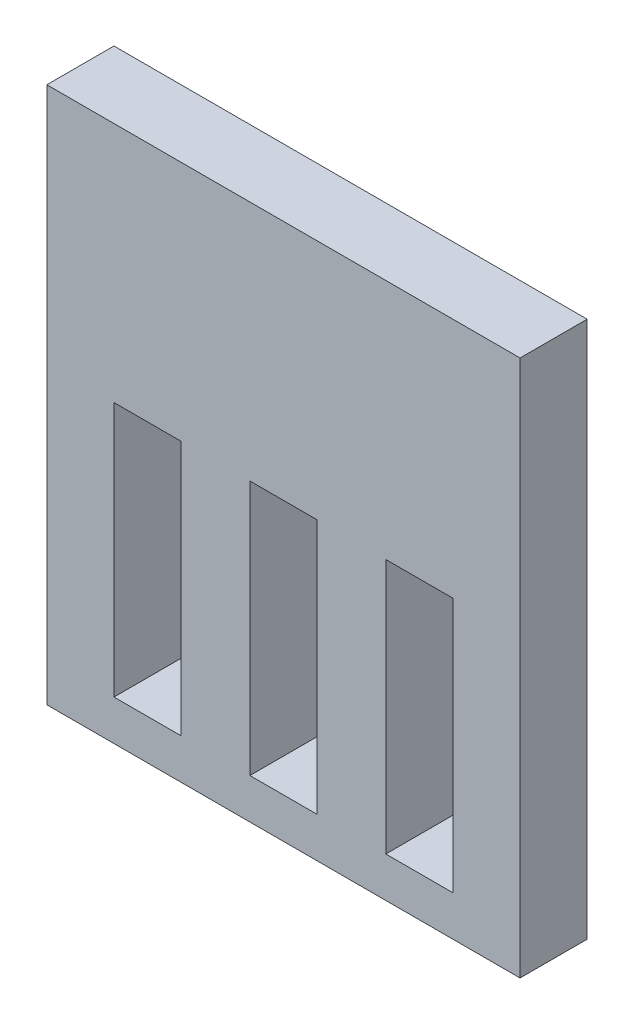
ISO-10303-21;
HEADER;
FILE_DESCRIPTION(('STEP AP214'),'2;1');
FILE_NAME('part.step','',(''),(''),'','','');
FILE_SCHEMA(('AUTOMOTIVE_DESIGN { 1 0 10303 214 1 1 1 1 }'));
ENDSEC;
DATA;
#1=APPLICATION_CONTEXT('core data for automotive mechanical design processes');
#2=APPLICATION_PROTOCOL_DEFINITION('international standard','automotive_design',2000,#1);
#3=PRODUCT_CONTEXT('',#1,'mechanical');
#4=PRODUCT('Part','Part','',(#3));
#5=PRODUCT_RELATED_PRODUCT_CATEGORY('part','',(#4));
#6=PRODUCT_DEFINITION_FORMATION('','',#4);
#7=PRODUCT_DEFINITION_CONTEXT('part definition',#1,'design');
#8=PRODUCT_DEFINITION('design','',#6,#7);
#9=PRODUCT_DEFINITION_SHAPE('','',#8);
#10=(LENGTH_UNIT() NAMED_UNIT(*) SI_UNIT(.MILLI.,.METRE.));
#11=(NAMED_UNIT(*) PLANE_ANGLE_UNIT() SI_UNIT($,.RADIAN.));
#12=(NAMED_UNIT(*) SI_UNIT($,.STERADIAN.) SOLID_ANGLE_UNIT());
#13=UNCERTAINTY_MEASURE_WITH_UNIT(LENGTH_MEASURE(1.E-05),#10,'distance_accuracy_value','');
#14=(GEOMETRIC_REPRESENTATION_CONTEXT(3) GLOBAL_UNCERTAINTY_ASSIGNED_CONTEXT((#13)) GLOBAL_UNIT_ASSIGNED_CONTEXT((#10,
#11,#12)) REPRESENTATION_CONTEXT('',''));
#15=CARTESIAN_POINT('',(0.,0.,0.));
#16=DIRECTION('',(0.,0.,1.));
#17=DIRECTION('',(1.,0.,0.));
#18=AXIS2_PLACEMENT_3D('',#15,#16,#17);
#19=CARTESIAN_POINT('',(-35.25,0.,10.));
#20=DIRECTION('',(1.,0.,0.));
#21=DIRECTION('',(0.,0.,-1.));
#22=AXIS2_PLACEMENT_3D('',#19,#20,#21);
#23=PLANE('',#22);
#24=DIRECTION('',(0.,-1.,0.));
#25=VECTOR('',#24,1.);
#26=CARTESIAN_POINT('',(-35.25,0.,0.));
#27=LINE('',#26,#25);
#28=CARTESIAN_POINT('',(-35.25,80.,0.));
#29=VERTEX_POINT('',#28);
#30=CARTESIAN_POINT('',(-35.25,0.,0.));
#31=VERTEX_POINT('',#30);
#32=EDGE_CURVE('E181',#29,#31,#27,.T.);
#33=ORIENTED_EDGE('',*,*,#32,.T.);
#34=DIRECTION('',(0.,0.,-1.));
#35=VECTOR('',#34,1.);
#36=CARTESIAN_POINT('',(-35.25,0.,10.));
#37=LINE('',#36,#35);
#38=CARTESIAN_POINT('',(-35.25,0.,10.));
#39=VERTEX_POINT('',#38);
#40=EDGE_CURVE('E44',#39,#31,#37,.T.);
#41=ORIENTED_EDGE('',*,*,#40,.F.);
#42=DIRECTION('',(0.,-1.,0.));
#43=VECTOR('',#42,1.);
#44=CARTESIAN_POINT('',(-35.25,0.,10.));
#45=LINE('',#44,#43);
#46=CARTESIAN_POINT('',(-35.25,80.,10.));
#47=VERTEX_POINT('',#46);
#48=EDGE_CURVE('E221',#47,#39,#45,.T.);
#49=ORIENTED_EDGE('',*,*,#48,.F.);
#50=DIRECTION('',(0.,0.,-1.));
#51=VECTOR('',#50,1.);
#52=CARTESIAN_POINT('',(-35.25,80.,10.));
#53=LINE('',#52,#51);
#54=EDGE_CURVE('E231',#47,#29,#53,.T.);
#55=ORIENTED_EDGE('',*,*,#54,.T.);
#56=EDGE_LOOP('',(#33,#41,#49,#55));
#57=FACE_BOUND('',#56,.T.);
#58=ADVANCED_FACE('F37',(#57),#23,.F.);
#59=CARTESIAN_POINT('',(-35.25,0.,10.));
#60=DIRECTION('',(0.,1.,0.));
#61=DIRECTION('',(-1.,0.,0.));
#62=AXIS2_PLACEMENT_3D('',#59,#60,#61);
#63=PLANE('',#62);
#64=DIRECTION('',(1.,0.,0.));
#65=VECTOR('',#64,1.);
#66=CARTESIAN_POINT('',(-35.25,0.,0.));
#67=LINE('',#66,#65);
#68=CARTESIAN_POINT('',(35.25,0.,0.));
#69=VERTEX_POINT('',#68);
#70=EDGE_CURVE('E234',#31,#69,#67,.T.);
#71=ORIENTED_EDGE('',*,*,#70,.T.);
#72=DIRECTION('',(0.,0.,-1.));
#73=VECTOR('',#72,1.);
#74=CARTESIAN_POINT('',(35.25,0.,10.));
#75=LINE('',#74,#73);
#76=CARTESIAN_POINT('',(35.25,0.,10.));
#77=VERTEX_POINT('',#76);
#78=EDGE_CURVE('E244',#77,#69,#75,.T.);
#79=ORIENTED_EDGE('',*,*,#78,.F.);
#80=DIRECTION('',(1.,0.,0.));
#81=VECTOR('',#80,1.);
#82=CARTESIAN_POINT('',(-35.25,0.,10.));
#83=LINE('',#82,#81);
#84=EDGE_CURVE('E224',#39,#77,#83,.T.);
#85=ORIENTED_EDGE('',*,*,#84,.F.);
#86=ORIENTED_EDGE('',*,*,#40,.T.);
#87=EDGE_LOOP('',(#71,#79,#85,#86));
#88=FACE_BOUND('',#87,.T.);
#89=ADVANCED_FACE('F249',(#88),#63,.F.);
#90=CARTESIAN_POINT('',(35.25,0.,10.));
#91=DIRECTION('',(-1.,0.,0.));
#92=DIRECTION('',(0.,0.,1.));
#93=AXIS2_PLACEMENT_3D('',#90,#91,#92);
#94=PLANE('',#93);
#95=DIRECTION('',(0.,1.,0.));
#96=VECTOR('',#95,1.);
#97=CARTESIAN_POINT('',(35.25,0.,0.));
#98=LINE('',#97,#96);
#99=CARTESIAN_POINT('',(35.25,80.,0.));
#100=VERTEX_POINT('',#99);
#101=EDGE_CURVE('E236',#69,#100,#98,.T.);
#102=ORIENTED_EDGE('',*,*,#101,.T.);
#103=DIRECTION('',(0.,0.,-1.));
#104=VECTOR('',#103,1.);
#105=CARTESIAN_POINT('',(35.25,80.,10.));
#106=LINE('',#105,#104);
#107=CARTESIAN_POINT('',(35.25,80.,10.));
#108=VERTEX_POINT('',#107);
#109=EDGE_CURVE('E241',#108,#100,#106,.T.);
#110=ORIENTED_EDGE('',*,*,#109,.F.);
#111=DIRECTION('',(0.,1.,0.));
#112=VECTOR('',#111,1.);
#113=CARTESIAN_POINT('',(35.25,0.,10.));
#114=LINE('',#113,#112);
#115=EDGE_CURVE('E227',#77,#108,#114,.T.);
#116=ORIENTED_EDGE('',*,*,#115,.F.);
#117=ORIENTED_EDGE('',*,*,#78,.T.);
#118=EDGE_LOOP('',(#102,#110,#116,#117));
#119=FACE_BOUND('',#118,.T.);
#120=ADVANCED_FACE('F260',(#119),#94,.F.);
#121=CARTESIAN_POINT('',(-35.25,80.,10.));
#122=DIRECTION('',(0.,-1.,0.));
#123=DIRECTION('',(1.,0.,0.));
#124=AXIS2_PLACEMENT_3D('',#121,#122,#123);
#125=PLANE('',#124);
#126=DIRECTION('',(-1.,0.,0.));
#127=VECTOR('',#126,1.);
#128=CARTESIAN_POINT('',(-35.25,80.,0.));
#129=LINE('',#128,#127);
#130=EDGE_CURVE('E225',#100,#29,#129,.T.);
#131=ORIENTED_EDGE('',*,*,#130,.T.);
#132=ORIENTED_EDGE('',*,*,#54,.F.);
#133=DIRECTION('',(-1.,0.,0.));
#134=VECTOR('',#133,1.);
#135=CARTESIAN_POINT('',(-35.25,80.,10.));
#136=LINE('',#135,#134);
#137=EDGE_CURVE('E229',#108,#47,#136,.T.);
#138=ORIENTED_EDGE('',*,*,#137,.F.);
#139=ORIENTED_EDGE('',*,*,#109,.T.);
#140=EDGE_LOOP('',(#131,#132,#138,#139));
#141=FACE_BOUND('',#140,.T.);
#142=ADVANCED_FACE('F264',(#141),#125,.F.);
#143=CARTESIAN_POINT('',(0.,0.,10.));
#144=DIRECTION('',(0.,0.,-1.));
#145=DIRECTION('',(-1.,0.,0.));
#146=AXIS2_PLACEMENT_3D('',#143,#144,#145);
#147=PLANE('',#146);
#148=DIRECTION('',(1.,0.,0.));
#149=VECTOR('',#148,1.);
#150=CARTESIAN_POINT('',(-25.25,44.,10.));
#151=LINE('',#150,#149);
#152=CARTESIAN_POINT('',(-4.99999999999999,44.,10.));
#153=VERTEX_POINT('',#152);
#154=CARTESIAN_POINT('',(5.00000000000001,44.,10.));
#155=VERTEX_POINT('',#154);
#156=EDGE_CURVE('E477',#153,#155,#151,.T.);
#157=ORIENTED_EDGE('',*,*,#156,.T.);
#158=DIRECTION('',(0.,1.,0.));
#159=VECTOR('',#158,1.);
#160=CARTESIAN_POINT('',(5.00000000000001,6.00000000000001,10.));
#161=LINE('',#160,#159);
#162=CARTESIAN_POINT('',(5.00000000000001,6.00000000000001,10.));
#163=VERTEX_POINT('',#162);
#164=EDGE_CURVE('E209',#163,#155,#161,.T.);
#165=ORIENTED_EDGE('',*,*,#164,.F.);
#166=DIRECTION('',(1.,0.,0.));
#167=VECTOR('',#166,1.);
#168=CARTESIAN_POINT('',(5.00000000000001,6.00000000000001,10.));
#169=LINE('',#168,#167);
#170=CARTESIAN_POINT('',(-4.99999999999999,6.,10.));
#171=VERTEX_POINT('',#170);
#172=EDGE_CURVE('E211',#171,#163,#169,.T.);
#173=ORIENTED_EDGE('',*,*,#172,.F.);
#174=DIRECTION('',(0.,-1.,0.));
#175=VECTOR('',#174,1.);
#176=CARTESIAN_POINT('',(-4.99999999999999,6.,10.));
#177=LINE('',#176,#175);
#178=EDGE_CURVE('E189',#153,#171,#177,.T.);
#179=ORIENTED_EDGE('',*,*,#178,.F.);
#180=EDGE_LOOP('',(#157,#165,#173,#179));
#181=FACE_BOUND('',#180,.T.);
#182=CARTESIAN_POINT('',(-25.25,44.,10.));
#183=VERTEX_POINT('',#182);
#184=CARTESIAN_POINT('',(-15.25,44.,10.));
#185=VERTEX_POINT('',#184);
#186=EDGE_CURVE('E483',#183,#185,#151,.T.);
#187=ORIENTED_EDGE('',*,*,#186,.T.);
#188=DIRECTION('',(0.,1.,0.));
#189=VECTOR('',#188,1.);
#190=CARTESIAN_POINT('',(-15.25,74.,10.));
#191=LINE('',#190,#189);
#192=CARTESIAN_POINT('',(-15.25,5.99999999999999,10.));
#193=VERTEX_POINT('',#192);
#194=EDGE_CURVE('E157',#193,#185,#191,.T.);
#195=ORIENTED_EDGE('',*,*,#194,.F.);
#196=DIRECTION('',(1.,0.,0.));
#197=VECTOR('',#196,1.);
#198=CARTESIAN_POINT('',(-25.25,5.99999999999999,10.));
#199=LINE('',#198,#197);
#200=CARTESIAN_POINT('',(-25.25,5.99999999999999,10.));
#201=VERTEX_POINT('',#200);
#202=EDGE_CURVE('E177',#201,#193,#199,.T.);
#203=ORIENTED_EDGE('',*,*,#202,.F.);
#204=DIRECTION('',(0.,-1.,0.));
#205=VECTOR('',#204,1.);
#206=CARTESIAN_POINT('',(-25.25,74.,10.));
#207=LINE('',#206,#205);
#208=EDGE_CURVE('E163',#183,#201,#207,.T.);
#209=ORIENTED_EDGE('',*,*,#208,.F.);
#210=EDGE_LOOP('',(#187,#195,#203,#209));
#211=FACE_BOUND('',#210,.T.);
#212=DIRECTION('',(0.,-1.,0.));
#213=VECTOR('',#212,1.);
#214=CARTESIAN_POINT('',(15.25,74.,10.));
#215=LINE('',#214,#213);
#216=CARTESIAN_POINT('',(15.25,44.,10.));
#217=VERTEX_POINT('',#216);
#218=CARTESIAN_POINT('',(15.25,5.99999999999999,10.));
#219=VERTEX_POINT('',#218);
#220=EDGE_CURVE('E193',#217,#219,#215,.T.);
#221=ORIENTED_EDGE('',*,*,#220,.F.);
#222=CARTESIAN_POINT('',(25.25,44.,10.));
#223=VERTEX_POINT('',#222);
#224=EDGE_CURVE('E487',#217,#223,#151,.T.);
#225=ORIENTED_EDGE('',*,*,#224,.T.);
#226=DIRECTION('',(0.,1.,0.));
#227=VECTOR('',#226,1.);
#228=CARTESIAN_POINT('',(25.25,74.,10.));
#229=LINE('',#228,#227);
#230=CARTESIAN_POINT('',(25.25,5.99999999999999,10.));
#231=VERTEX_POINT('',#230);
#232=EDGE_CURVE('E178',#231,#223,#229,.T.);
#233=ORIENTED_EDGE('',*,*,#232,.F.);
#234=DIRECTION('',(1.,0.,0.));
#235=VECTOR('',#234,1.);
#236=CARTESIAN_POINT('',(25.25,5.99999999999999,10.));
#237=LINE('',#236,#235);
#238=EDGE_CURVE('E190',#219,#231,#237,.T.);
#239=ORIENTED_EDGE('',*,*,#238,.F.);
#240=EDGE_LOOP('',(#221,#225,#233,#239));
#241=FACE_BOUND('',#240,.T.);
#242=ORIENTED_EDGE('',*,*,#48,.T.);
#243=ORIENTED_EDGE('',*,*,#84,.T.);
#244=ORIENTED_EDGE('',*,*,#115,.T.);
#245=ORIENTED_EDGE('',*,*,#137,.T.);
#246=EDGE_LOOP('',(#242,#243,#244,#245));
#247=FACE_BOUND('',#246,.T.);
#248=ADVANCED_FACE('F266',(#181,#211,#241,#247),#147,.F.);
#249=CARTESIAN_POINT('',(0.,0.,0.));
#250=DIRECTION('',(0.,0.,-1.));
#251=DIRECTION('',(-1.,0.,0.));
#252=AXIS2_PLACEMENT_3D('',#249,#250,#251);
#253=PLANE('',#252);
#254=DIRECTION('',(0.,1.,0.));
#255=VECTOR('',#254,1.);
#256=CARTESIAN_POINT('',(5.00000000000001,6.00000000000001,0.));
#257=LINE('',#256,#255);
#258=CARTESIAN_POINT('',(5.00000000000001,6.00000000000001,0.));
#259=VERTEX_POINT('',#258);
#260=CARTESIAN_POINT('',(5.00000000000001,44.,0.));
#261=VERTEX_POINT('',#260);
#262=EDGE_CURVE('E206',#259,#261,#257,.T.);
#263=ORIENTED_EDGE('',*,*,#262,.T.);
#264=DIRECTION('',(1.,0.,0.));
#265=VECTOR('',#264,1.);
#266=CARTESIAN_POINT('',(-25.25,44.,0.));
#267=LINE('',#266,#265);
#268=CARTESIAN_POINT('',(-4.99999999999999,44.,0.));
#269=VERTEX_POINT('',#268);
#270=EDGE_CURVE('E476',#269,#261,#267,.T.);
#271=ORIENTED_EDGE('',*,*,#270,.F.);
#272=DIRECTION('',(0.,-1.,0.));
#273=VECTOR('',#272,1.);
#274=CARTESIAN_POINT('',(-4.99999999999999,6.,0.));
#275=LINE('',#274,#273);
#276=CARTESIAN_POINT('',(-4.99999999999999,6.,0.));
#277=VERTEX_POINT('',#276);
#278=EDGE_CURVE('E51',#269,#277,#275,.T.);
#279=ORIENTED_EDGE('',*,*,#278,.T.);
#280=DIRECTION('',(1.,0.,0.));
#281=VECTOR('',#280,1.);
#282=CARTESIAN_POINT('',(5.00000000000001,6.00000000000001,0.));
#283=LINE('',#282,#281);
#284=EDGE_CURVE('E217',#277,#259,#283,.T.);
#285=ORIENTED_EDGE('',*,*,#284,.T.);
#286=EDGE_LOOP('',(#263,#271,#279,#285));
#287=FACE_BOUND('',#286,.T.);
#288=DIRECTION('',(0.,1.,0.));
#289=VECTOR('',#288,1.);
#290=CARTESIAN_POINT('',(-15.25,74.,0.));
#291=LINE('',#290,#289);
#292=CARTESIAN_POINT('',(-15.25,5.99999999999999,0.));
#293=VERTEX_POINT('',#292);
#294=CARTESIAN_POINT('',(-15.25,44.,0.));
#295=VERTEX_POINT('',#294);
#296=EDGE_CURVE('E168',#293,#295,#291,.T.);
#297=ORIENTED_EDGE('',*,*,#296,.T.);
#298=CARTESIAN_POINT('',(-25.25,44.,0.));
#299=VERTEX_POINT('',#298);
#300=EDGE_CURVE('E154',#299,#295,#267,.T.);
#301=ORIENTED_EDGE('',*,*,#300,.F.);
#302=DIRECTION('',(0.,-1.,0.));
#303=VECTOR('',#302,1.);
#304=CARTESIAN_POINT('',(-25.25,74.,0.));
#305=LINE('',#304,#303);
#306=CARTESIAN_POINT('',(-25.25,5.99999999999999,0.));
#307=VERTEX_POINT('',#306);
#308=EDGE_CURVE('E146',#299,#307,#305,.T.);
#309=ORIENTED_EDGE('',*,*,#308,.T.);
#310=DIRECTION('',(1.,0.,0.));
#311=VECTOR('',#310,1.);
#312=CARTESIAN_POINT('',(-25.25,5.99999999999999,0.));
#313=LINE('',#312,#311);
#314=EDGE_CURVE('E152',#307,#293,#313,.T.);
#315=ORIENTED_EDGE('',*,*,#314,.T.);
#316=EDGE_LOOP('',(#297,#301,#309,#315));
#317=FACE_BOUND('',#316,.T.);
#318=CARTESIAN_POINT('',(15.25,44.,0.));
#319=VERTEX_POINT('',#318);
#320=CARTESIAN_POINT('',(25.25,44.,0.));
#321=VERTEX_POINT('',#320);
#322=EDGE_CURVE('E479',#319,#321,#267,.T.);
#323=ORIENTED_EDGE('',*,*,#322,.F.);
#324=DIRECTION('',(0.,-1.,0.));
#325=VECTOR('',#324,1.);
#326=CARTESIAN_POINT('',(15.25,74.,0.));
#327=LINE('',#326,#325);
#328=CARTESIAN_POINT('',(15.25,5.99999999999999,0.));
#329=VERTEX_POINT('',#328);
#330=EDGE_CURVE('E199',#319,#329,#327,.T.);
#331=ORIENTED_EDGE('',*,*,#330,.T.);
#332=DIRECTION('',(1.,0.,0.));
#333=VECTOR('',#332,1.);
#334=CARTESIAN_POINT('',(25.25,5.99999999999999,0.));
#335=LINE('',#334,#333);
#336=CARTESIAN_POINT('',(25.25,5.99999999999999,0.));
#337=VERTEX_POINT('',#336);
#338=EDGE_CURVE('E186',#329,#337,#335,.T.);
#339=ORIENTED_EDGE('',*,*,#338,.T.);
#340=DIRECTION('',(0.,1.,0.));
#341=VECTOR('',#340,1.);
#342=CARTESIAN_POINT('',(25.25,74.,0.));
#343=LINE('',#342,#341);
#344=EDGE_CURVE('E194',#337,#321,#343,.T.);
#345=ORIENTED_EDGE('',*,*,#344,.T.);
#346=EDGE_LOOP('',(#323,#331,#339,#345));
#347=FACE_BOUND('',#346,.T.);
#348=ORIENTED_EDGE('',*,*,#32,.F.);
#349=ORIENTED_EDGE('',*,*,#130,.F.);
#350=ORIENTED_EDGE('',*,*,#101,.F.);
#351=ORIENTED_EDGE('',*,*,#70,.F.);
#352=EDGE_LOOP('',(#348,#349,#350,#351));
#353=FACE_BOUND('',#352,.T.);
#354=ADVANCED_FACE('F149',(#287,#317,#347,#353),#253,.T.);
#355=CARTESIAN_POINT('',(-4.99999999999999,6.,0.));
#356=DIRECTION('',(-1.,0.,0.));
#357=DIRECTION('',(0.,-1.,0.));
#358=AXIS2_PLACEMENT_3D('',#355,#356,#357);
#359=PLANE('',#358);
#360=ORIENTED_EDGE('',*,*,#278,.F.);
#361=DIRECTION('',(0.,0.,1.));
#362=VECTOR('',#361,1.);
#363=CARTESIAN_POINT('',(-4.99999999999999,44.,0.));
#364=LINE('',#363,#362);
#365=EDGE_CURVE('E55',#269,#153,#364,.T.);
#366=ORIENTED_EDGE('',*,*,#365,.T.);
#367=ORIENTED_EDGE('',*,*,#178,.T.);
#368=DIRECTION('',(0.,0.,1.));
#369=VECTOR('',#368,1.);
#370=CARTESIAN_POINT('',(-4.99999999999999,6.,0.));
#371=LINE('',#370,#369);
#372=EDGE_CURVE('E203',#277,#171,#371,.T.);
#373=ORIENTED_EDGE('',*,*,#372,.F.);
#374=EDGE_LOOP('',(#360,#366,#367,#373));
#375=FACE_BOUND('',#374,.T.);
#376=ADVANCED_FACE('F274',(#375),#359,.F.);
#377=CARTESIAN_POINT('',(5.00000000000001,6.00000000000001,0.));
#378=DIRECTION('',(1.,0.,0.));
#379=DIRECTION('',(0.,1.,0.));
#380=AXIS2_PLACEMENT_3D('',#377,#378,#379);
#381=PLANE('',#380);
#382=ORIENTED_EDGE('',*,*,#164,.T.);
#383=DIRECTION('',(0.,0.,-1.));
#384=VECTOR('',#383,1.);
#385=CARTESIAN_POINT('',(5.00000000000001,44.,0.));
#386=LINE('',#385,#384);
#387=EDGE_CURVE('E478',#155,#261,#386,.T.);
#388=ORIENTED_EDGE('',*,*,#387,.T.);
#389=ORIENTED_EDGE('',*,*,#262,.F.);
#390=DIRECTION('',(0.,0.,1.));
#391=VECTOR('',#390,1.);
#392=CARTESIAN_POINT('',(5.00000000000001,6.00000000000001,0.));
#393=LINE('',#392,#391);
#394=EDGE_CURVE('E207',#259,#163,#393,.T.);
#395=ORIENTED_EDGE('',*,*,#394,.T.);
#396=EDGE_LOOP('',(#382,#388,#389,#395));
#397=FACE_BOUND('',#396,.T.);
#398=ADVANCED_FACE('F308',(#397),#381,.F.);
#399=CARTESIAN_POINT('',(5.00000000000001,6.00000000000001,0.));
#400=DIRECTION('',(0.,-1.,0.));
#401=DIRECTION('',(1.,0.,0.));
#402=AXIS2_PLACEMENT_3D('',#399,#400,#401);
#403=PLANE('',#402);
#404=ORIENTED_EDGE('',*,*,#172,.T.);
#405=ORIENTED_EDGE('',*,*,#394,.F.);
#406=ORIENTED_EDGE('',*,*,#284,.F.);
#407=ORIENTED_EDGE('',*,*,#372,.T.);
#408=EDGE_LOOP('',(#404,#405,#406,#407));
#409=FACE_BOUND('',#408,.T.);
#410=ADVANCED_FACE('F302',(#409),#403,.F.);
#411=CARTESIAN_POINT('',(25.25,74.,0.));
#412=DIRECTION('',(1.,0.,0.));
#413=DIRECTION('',(0.,1.,0.));
#414=AXIS2_PLACEMENT_3D('',#411,#412,#413);
#415=PLANE('',#414);
#416=ORIENTED_EDGE('',*,*,#232,.T.);
#417=DIRECTION('',(0.,0.,1.));
#418=VECTOR('',#417,1.);
#419=CARTESIAN_POINT('',(25.25,44.,0.));
#420=LINE('',#419,#418);
#421=EDGE_CURVE('E488',#321,#223,#420,.T.);
#422=ORIENTED_EDGE('',*,*,#421,.F.);
#423=ORIENTED_EDGE('',*,*,#344,.F.);
#424=DIRECTION('',(0.,0.,1.));
#425=VECTOR('',#424,1.);
#426=CARTESIAN_POINT('',(25.25,5.99999999999999,0.));
#427=LINE('',#426,#425);
#428=EDGE_CURVE('E187',#337,#231,#427,.T.);
#429=ORIENTED_EDGE('',*,*,#428,.T.);
#430=EDGE_LOOP('',(#416,#422,#423,#429));
#431=FACE_BOUND('',#430,.T.);
#432=ADVANCED_FACE('F307',(#431),#415,.F.);
#433=CARTESIAN_POINT('',(25.25,5.99999999999999,0.));
#434=DIRECTION('',(0.,-1.,0.));
#435=DIRECTION('',(0.,0.,-1.));
#436=AXIS2_PLACEMENT_3D('',#433,#434,#435);
#437=PLANE('',#436);
#438=ORIENTED_EDGE('',*,*,#238,.T.);
#439=ORIENTED_EDGE('',*,*,#428,.F.);
#440=ORIENTED_EDGE('',*,*,#338,.F.);
#441=DIRECTION('',(0.,0.,1.));
#442=VECTOR('',#441,1.);
#443=CARTESIAN_POINT('',(15.25,5.99999999999999,0.));
#444=LINE('',#443,#442);
#445=EDGE_CURVE('E183',#329,#219,#444,.T.);
#446=ORIENTED_EDGE('',*,*,#445,.T.);
#447=EDGE_LOOP('',(#438,#439,#440,#446));
#448=FACE_BOUND('',#447,.T.);
#449=ADVANCED_FACE('F319',(#448),#437,.F.);
#450=CARTESIAN_POINT('',(15.25,74.,0.));
#451=DIRECTION('',(-1.,0.,0.));
#452=DIRECTION('',(0.,-1.,0.));
#453=AXIS2_PLACEMENT_3D('',#450,#451,#452);
#454=PLANE('',#453);
#455=ORIENTED_EDGE('',*,*,#330,.F.);
#456=DIRECTION('',(0.,0.,1.));
#457=VECTOR('',#456,1.);
#458=CARTESIAN_POINT('',(15.25,44.,0.));
#459=LINE('',#458,#457);
#460=EDGE_CURVE('E491',#319,#217,#459,.T.);
#461=ORIENTED_EDGE('',*,*,#460,.T.);
#462=ORIENTED_EDGE('',*,*,#220,.T.);
#463=ORIENTED_EDGE('',*,*,#445,.F.);
#464=EDGE_LOOP('',(#455,#461,#462,#463));
#465=FACE_BOUND('',#464,.T.);
#466=ADVANCED_FACE('F324',(#465),#454,.F.);
#467=CARTESIAN_POINT('',(-25.25,74.,0.));
#468=DIRECTION('',(-1.,0.,0.));
#469=DIRECTION('',(0.,0.,1.));
#470=AXIS2_PLACEMENT_3D('',#467,#468,#469);
#471=PLANE('',#470);
#472=ORIENTED_EDGE('',*,*,#308,.F.);
#473=DIRECTION('',(0.,0.,1.));
#474=VECTOR('',#473,1.);
#475=CARTESIAN_POINT('',(-25.25,44.,0.));
#476=LINE('',#475,#474);
#477=EDGE_CURVE('E481',#299,#183,#476,.T.);
#478=ORIENTED_EDGE('',*,*,#477,.T.);
#479=ORIENTED_EDGE('',*,*,#208,.T.);
#480=DIRECTION('',(0.,0.,1.));
#481=VECTOR('',#480,1.);
#482=CARTESIAN_POINT('',(-25.25,5.99999999999999,0.));
#483=LINE('',#482,#481);
#484=EDGE_CURVE('E160',#307,#201,#483,.T.);
#485=ORIENTED_EDGE('',*,*,#484,.F.);
#486=EDGE_LOOP('',(#472,#478,#479,#485));
#487=FACE_BOUND('',#486,.T.);
#488=ADVANCED_FACE('F161',(#487),#471,.F.);
#489=CARTESIAN_POINT('',(-15.25,74.,0.));
#490=DIRECTION('',(1.,0.,0.));
#491=DIRECTION('',(0.,0.,-1.));
#492=AXIS2_PLACEMENT_3D('',#489,#490,#491);
#493=PLANE('',#492);
#494=ORIENTED_EDGE('',*,*,#194,.T.);
#495=DIRECTION('',(0.,0.,-1.));
#496=VECTOR('',#495,1.);
#497=CARTESIAN_POINT('',(-15.25,44.,0.));
#498=LINE('',#497,#496);
#499=EDGE_CURVE('E11',#185,#295,#498,.T.);
#500=ORIENTED_EDGE('',*,*,#499,.T.);
#501=ORIENTED_EDGE('',*,*,#296,.F.);
#502=DIRECTION('',(0.,0.,1.));
#503=VECTOR('',#502,1.);
#504=CARTESIAN_POINT('',(-15.25,5.99999999999999,0.));
#505=LINE('',#504,#503);
#506=EDGE_CURVE('E167',#293,#193,#505,.T.);
#507=ORIENTED_EDGE('',*,*,#506,.T.);
#508=EDGE_LOOP('',(#494,#500,#501,#507));
#509=FACE_BOUND('',#508,.T.);
#510=ADVANCED_FACE('F337',(#509),#493,.F.);
#511=CARTESIAN_POINT('',(-25.25,5.99999999999999,0.));
#512=DIRECTION('',(0.,-1.,0.));
#513=DIRECTION('',(0.,0.,-1.));
#514=AXIS2_PLACEMENT_3D('',#511,#512,#513);
#515=PLANE('',#514);
#516=ORIENTED_EDGE('',*,*,#202,.T.);
#517=ORIENTED_EDGE('',*,*,#506,.F.);
#518=ORIENTED_EDGE('',*,*,#314,.F.);
#519=ORIENTED_EDGE('',*,*,#484,.T.);
#520=EDGE_LOOP('',(#516,#517,#518,#519));
#521=FACE_BOUND('',#520,.T.);
#522=ADVANCED_FACE('F171',(#521),#515,.F.);
#523=CARTESIAN_POINT('',(-25.25,44.,0.));
#524=DIRECTION('',(0.,-1.,0.));
#525=DIRECTION('',(0.,0.,-1.));
#526=AXIS2_PLACEMENT_3D('',#523,#524,#525);
#527=PLANE('',#526);
#528=ORIENTED_EDGE('',*,*,#499,.F.);
#529=ORIENTED_EDGE('',*,*,#186,.F.);
#530=ORIENTED_EDGE('',*,*,#477,.F.);
#531=ORIENTED_EDGE('',*,*,#300,.T.);
#532=EDGE_LOOP('',(#528,#529,#530,#531));
#533=FACE_BOUND('',#532,.T.);
#534=ADVANCED_FACE('F336',(#533),#527,.T.);
#535=ORIENTED_EDGE('',*,*,#460,.F.);
#536=ORIENTED_EDGE('',*,*,#322,.T.);
#537=ORIENTED_EDGE('',*,*,#421,.T.);
#538=ORIENTED_EDGE('',*,*,#224,.F.);
#539=EDGE_LOOP('',(#535,#536,#537,#538));
#540=FACE_BOUND('',#539,.T.);
#541=ADVANCED_FACE('F410',(#540),#527,.T.);
#542=ORIENTED_EDGE('',*,*,#365,.F.);
#543=ORIENTED_EDGE('',*,*,#270,.T.);
#544=ORIENTED_EDGE('',*,*,#387,.F.);
#545=ORIENTED_EDGE('',*,*,#156,.F.);
#546=EDGE_LOOP('',(#542,#543,#544,#545));
#547=FACE_BOUND('',#546,.T.);
#548=ADVANCED_FACE('F413',(#547),#527,.T.);
#549=CLOSED_SHELL('',(#58,#89,#120,#142,#248,#354,#376,#398,#410,#432,#449,#466,#488,#510,#522,
#534,#541,#548));
#550=MANIFOLD_SOLID_BREP('B2',#549);
#551=ADVANCED_BREP_SHAPE_REPRESENTATION('',(#18,#550),#14);
#552=SHAPE_DEFINITION_REPRESENTATION(#9,#551);
ENDSEC;
END-ISO-10303-21;
